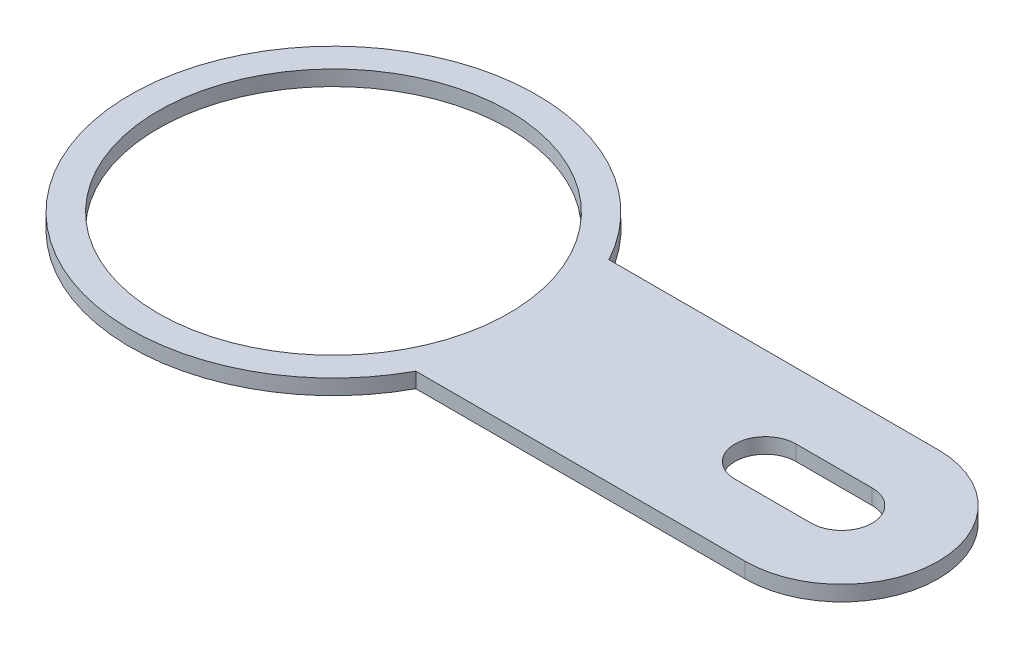
ISO-10303-21;
HEADER;
FILE_DESCRIPTION(('STEP AP214'),'2;1');
FILE_NAME('part.step','',(''),(''),'','','');
FILE_SCHEMA(('AUTOMOTIVE_DESIGN { 1 0 10303 214 1 1 1 1 }'));
ENDSEC;
DATA;
#1=APPLICATION_CONTEXT('core data for automotive mechanical design processes');
#2=APPLICATION_PROTOCOL_DEFINITION('international standard','automotive_design',2000,#1);
#3=PRODUCT_CONTEXT('',#1,'mechanical');
#4=PRODUCT('Part','Part','',(#3));
#5=PRODUCT_RELATED_PRODUCT_CATEGORY('part','',(#4));
#6=PRODUCT_DEFINITION_FORMATION('','',#4);
#7=PRODUCT_DEFINITION_CONTEXT('part definition',#1,'design');
#8=PRODUCT_DEFINITION('design','',#6,#7);
#9=PRODUCT_DEFINITION_SHAPE('','',#8);
#10=(LENGTH_UNIT() NAMED_UNIT(*) SI_UNIT(.MILLI.,.METRE.));
#11=(NAMED_UNIT(*) PLANE_ANGLE_UNIT() SI_UNIT($,.RADIAN.));
#12=(NAMED_UNIT(*) SI_UNIT($,.STERADIAN.) SOLID_ANGLE_UNIT());
#13=UNCERTAINTY_MEASURE_WITH_UNIT(LENGTH_MEASURE(1.E-05),#10,'distance_accuracy_value','');
#14=(GEOMETRIC_REPRESENTATION_CONTEXT(3) GLOBAL_UNCERTAINTY_ASSIGNED_CONTEXT((#13)) GLOBAL_UNIT_ASSIGNED_CONTEXT((#10,
#11,#12)) REPRESENTATION_CONTEXT('',''));
#15=CARTESIAN_POINT('',(0.,0.,0.));
#16=DIRECTION('',(0.,0.,1.));
#17=DIRECTION('',(1.,0.,0.));
#18=AXIS2_PLACEMENT_3D('',#15,#16,#17);
#19=CARTESIAN_POINT('',(10.,0.3,0.));
#20=DIRECTION('',(0.,-1.,0.));
#21=DIRECTION('',(0.,0.,-1.));
#22=AXIS2_PLACEMENT_3D('',#19,#20,#21);
#23=PLANE('',#22);
#24=CARTESIAN_POINT('',(0.,0.3,0.));
#25=DIRECTION('',(0.,1.,0.));
#26=DIRECTION('',(0.,0.,1.));
#27=AXIS2_PLACEMENT_3D('',#24,#25,#26);
#28=CIRCLE('',#27,3.45);
#29=CARTESIAN_POINT('',(0.,0.3,3.45));
#30=VERTEX_POINT('',#29);
#31=EDGE_CURVE('E136',#30,#30,#28,.T.);
#32=ORIENTED_EDGE('',*,*,#31,.F.);
#33=EDGE_LOOP('',(#32));
#34=FACE_BOUND('',#33,.T.);
#35=CARTESIAN_POINT('',(10.,0.3,0.));
#36=DIRECTION('',(0.,1.,0.));
#37=DIRECTION('',(0.,0.,-1.));
#38=AXIS2_PLACEMENT_3D('',#35,#36,#37);
#39=CIRCLE('',#38,1.9);
#40=CARTESIAN_POINT('',(10.,0.3,1.9));
#41=VERTEX_POINT('',#40);
#42=CARTESIAN_POINT('',(10.,0.3,-1.9));
#43=VERTEX_POINT('',#42);
#44=EDGE_CURVE('E142',#41,#43,#39,.T.);
#45=ORIENTED_EDGE('',*,*,#44,.T.);
#46=DIRECTION('',(-1.,0.,0.));
#47=VECTOR('',#46,1.);
#48=CARTESIAN_POINT('',(3.51994318135961,0.3,-1.9));
#49=LINE('',#48,#47);
#50=CARTESIAN_POINT('',(3.51994318135961,0.3,-1.9));
#51=VERTEX_POINT('',#50);
#52=EDGE_CURVE('E145',#43,#51,#49,.T.);
#53=ORIENTED_EDGE('',*,*,#52,.T.);
#54=CARTESIAN_POINT('',(0.,0.3,0.));
#55=DIRECTION('',(0.,1.,0.));
#56=DIRECTION('',(0.,0.,-1.));
#57=AXIS2_PLACEMENT_3D('',#54,#55,#56);
#58=CIRCLE('',#57,4.);
#59=CARTESIAN_POINT('',(3.51994318135961,0.3,1.9));
#60=VERTEX_POINT('',#59);
#61=EDGE_CURVE('E148',#51,#60,#58,.T.);
#62=ORIENTED_EDGE('',*,*,#61,.T.);
#63=DIRECTION('',(1.,0.,0.));
#64=VECTOR('',#63,1.);
#65=CARTESIAN_POINT('',(3.51994318135961,0.3,1.9));
#66=LINE('',#65,#64);
#67=EDGE_CURVE('E150',#60,#41,#66,.T.);
#68=ORIENTED_EDGE('',*,*,#67,.T.);
#69=EDGE_LOOP('',(#45,#53,#62,#68));
#70=FACE_BOUND('',#69,.T.);
#71=CARTESIAN_POINT('',(10.,0.3,0.));
#72=DIRECTION('',(0.,1.,0.));
#73=DIRECTION('',(0.,0.,1.));
#74=AXIS2_PLACEMENT_3D('',#71,#72,#73);
#75=CIRCLE('',#74,0.6);
#76=CARTESIAN_POINT('',(10.,0.3,0.600000000000012));
#77=VERTEX_POINT('',#76);
#78=CARTESIAN_POINT('',(10.,0.3,-0.599999999999988));
#79=VERTEX_POINT('',#78);
#80=EDGE_CURVE('E100',#77,#79,#75,.T.);
#81=ORIENTED_EDGE('',*,*,#80,.F.);
#82=DIRECTION('',(1.,0.,0.));
#83=VECTOR('',#82,1.);
#84=CARTESIAN_POINT('',(10.,0.3,0.600000000000012));
#85=LINE('',#84,#83);
#86=CARTESIAN_POINT('',(8.5,0.3,0.600000000000012));
#87=VERTEX_POINT('',#86);
#88=EDGE_CURVE('E122',#87,#77,#85,.T.);
#89=ORIENTED_EDGE('',*,*,#88,.F.);
#90=CARTESIAN_POINT('',(8.5,0.3,0.));
#91=DIRECTION('',(0.,1.,0.));
#92=DIRECTION('',(0.,0.,1.));
#93=AXIS2_PLACEMENT_3D('',#90,#91,#92);
#94=CIRCLE('',#93,0.6);
#95=CARTESIAN_POINT('',(8.5,0.3,-0.599999999999988));
#96=VERTEX_POINT('',#95);
#97=EDGE_CURVE('E120',#96,#87,#94,.T.);
#98=ORIENTED_EDGE('',*,*,#97,.F.);
#99=DIRECTION('',(-1.,0.,0.));
#100=VECTOR('',#99,1.);
#101=CARTESIAN_POINT('',(10.,0.3,-0.599999999999988));
#102=LINE('',#101,#100);
#103=EDGE_CURVE('E108',#79,#96,#102,.T.);
#104=ORIENTED_EDGE('',*,*,#103,.F.);
#105=EDGE_LOOP('',(#81,#89,#98,#104));
#106=FACE_BOUND('',#105,.T.);
#107=ADVANCED_FACE('F35',(#34,#70,#106),#23,.F.);
#108=CARTESIAN_POINT('',(10.,0.,0.));
#109=DIRECTION('',(0.,-1.,0.));
#110=DIRECTION('',(0.,0.,-1.));
#111=AXIS2_PLACEMENT_3D('',#108,#109,#110);
#112=PLANE('',#111);
#113=CARTESIAN_POINT('',(0.,0.,0.));
#114=DIRECTION('',(0.,1.,0.));
#115=DIRECTION('',(0.,0.,1.));
#116=AXIS2_PLACEMENT_3D('',#113,#114,#115);
#117=CIRCLE('',#116,3.45);
#118=CARTESIAN_POINT('',(0.,0.,3.45));
#119=VERTEX_POINT('',#118);
#120=EDGE_CURVE('E116',#119,#119,#117,.T.);
#121=ORIENTED_EDGE('',*,*,#120,.T.);
#122=EDGE_LOOP('',(#121));
#123=FACE_BOUND('',#122,.T.);
#124=CARTESIAN_POINT('',(10.,0.,0.));
#125=DIRECTION('',(0.,1.,0.));
#126=DIRECTION('',(0.,0.,-1.));
#127=AXIS2_PLACEMENT_3D('',#124,#125,#126);
#128=CIRCLE('',#127,1.9);
#129=CARTESIAN_POINT('',(10.,0.,1.9));
#130=VERTEX_POINT('',#129);
#131=CARTESIAN_POINT('',(10.,0.,-1.9));
#132=VERTEX_POINT('',#131);
#133=EDGE_CURVE('E139',#130,#132,#128,.T.);
#134=ORIENTED_EDGE('',*,*,#133,.F.);
#135=DIRECTION('',(1.,0.,0.));
#136=VECTOR('',#135,1.);
#137=CARTESIAN_POINT('',(3.51994318135961,0.,1.9));
#138=LINE('',#137,#136);
#139=CARTESIAN_POINT('',(3.51994318135961,0.,1.9));
#140=VERTEX_POINT('',#139);
#141=EDGE_CURVE('E146',#140,#130,#138,.T.);
#142=ORIENTED_EDGE('',*,*,#141,.F.);
#143=CARTESIAN_POINT('',(0.,0.,0.));
#144=DIRECTION('',(0.,1.,0.));
#145=DIRECTION('',(0.,0.,-1.));
#146=AXIS2_PLACEMENT_3D('',#143,#144,#145);
#147=CIRCLE('',#146,4.);
#148=CARTESIAN_POINT('',(3.51994318135961,0.,-1.9));
#149=VERTEX_POINT('',#148);
#150=EDGE_CURVE('E157',#149,#140,#147,.T.);
#151=ORIENTED_EDGE('',*,*,#150,.F.);
#152=DIRECTION('',(-1.,0.,0.));
#153=VECTOR('',#152,1.);
#154=CARTESIAN_POINT('',(3.51994318135961,0.,-1.9));
#155=LINE('',#154,#153);
#156=EDGE_CURVE('E155',#132,#149,#155,.T.);
#157=ORIENTED_EDGE('',*,*,#156,.F.);
#158=EDGE_LOOP('',(#134,#142,#151,#157));
#159=FACE_BOUND('',#158,.T.);
#160=DIRECTION('',(1.,0.,0.));
#161=VECTOR('',#160,1.);
#162=CARTESIAN_POINT('',(10.,0.,0.600000000000012));
#163=LINE('',#162,#161);
#164=CARTESIAN_POINT('',(8.5,0.,0.600000000000012));
#165=VERTEX_POINT('',#164);
#166=CARTESIAN_POINT('',(10.,0.,0.600000000000012));
#167=VERTEX_POINT('',#166);
#168=EDGE_CURVE('E109',#165,#167,#163,.T.);
#169=ORIENTED_EDGE('',*,*,#168,.T.);
#170=CARTESIAN_POINT('',(10.,0.,0.));
#171=DIRECTION('',(0.,1.,0.));
#172=DIRECTION('',(0.,0.,1.));
#173=AXIS2_PLACEMENT_3D('',#170,#171,#172);
#174=CIRCLE('',#173,0.6);
#175=CARTESIAN_POINT('',(10.,0.,-0.599999999999988));
#176=VERTEX_POINT('',#175);
#177=EDGE_CURVE('E58',#167,#176,#174,.T.);
#178=ORIENTED_EDGE('',*,*,#177,.T.);
#179=DIRECTION('',(-1.,0.,0.));
#180=VECTOR('',#179,1.);
#181=CARTESIAN_POINT('',(10.,0.,-0.599999999999988));
#182=LINE('',#181,#180);
#183=CARTESIAN_POINT('',(8.5,0.,-0.599999999999988));
#184=VERTEX_POINT('',#183);
#185=EDGE_CURVE('E115',#176,#184,#182,.T.);
#186=ORIENTED_EDGE('',*,*,#185,.T.);
#187=CARTESIAN_POINT('',(8.5,0.,0.));
#188=DIRECTION('',(0.,1.,0.));
#189=DIRECTION('',(0.,0.,1.));
#190=AXIS2_PLACEMENT_3D('',#187,#188,#189);
#191=CIRCLE('',#190,0.6);
#192=EDGE_CURVE('E128',#184,#165,#191,.T.);
#193=ORIENTED_EDGE('',*,*,#192,.T.);
#194=EDGE_LOOP('',(#169,#178,#186,#193));
#195=FACE_BOUND('',#194,.T.);
#196=ADVANCED_FACE('F175',(#123,#159,#195),#112,.T.);
#197=CARTESIAN_POINT('',(10.,0.3,0.));
#198=DIRECTION('',(0.,-1.,0.));
#199=DIRECTION('',(0.,0.,-1.));
#200=AXIS2_PLACEMENT_3D('',#197,#198,#199);
#201=CYLINDRICAL_SURFACE('',#200,1.9);
#202=ORIENTED_EDGE('',*,*,#133,.T.);
#203=DIRECTION('',(0.,-1.,0.));
#204=VECTOR('',#203,1.);
#205=CARTESIAN_POINT('',(10.,0.3,-1.9));
#206=LINE('',#205,#204);
#207=EDGE_CURVE('E11',#43,#132,#206,.T.);
#208=ORIENTED_EDGE('',*,*,#207,.F.);
#209=ORIENTED_EDGE('',*,*,#44,.F.);
#210=DIRECTION('',(0.,-1.,0.));
#211=VECTOR('',#210,1.);
#212=CARTESIAN_POINT('',(10.,0.3,1.9));
#213=LINE('',#212,#211);
#214=EDGE_CURVE('E152',#41,#130,#213,.T.);
#215=ORIENTED_EDGE('',*,*,#214,.T.);
#216=EDGE_LOOP('',(#202,#208,#209,#215));
#217=FACE_BOUND('',#216,.T.);
#218=ADVANCED_FACE('F37',(#217),#201,.T.);
#219=CARTESIAN_POINT('',(3.51994318135961,0.3,-1.9));
#220=DIRECTION('',(0.,0.,1.));
#221=DIRECTION('',(1.,0.,0.));
#222=AXIS2_PLACEMENT_3D('',#219,#220,#221);
#223=PLANE('',#222);
#224=ORIENTED_EDGE('',*,*,#156,.T.);
#225=DIRECTION('',(0.,-1.,0.));
#226=VECTOR('',#225,1.);
#227=CARTESIAN_POINT('',(3.51994318135961,0.3,-1.9));
#228=LINE('',#227,#226);
#229=EDGE_CURVE('E43',#51,#149,#228,.T.);
#230=ORIENTED_EDGE('',*,*,#229,.F.);
#231=ORIENTED_EDGE('',*,*,#52,.F.);
#232=ORIENTED_EDGE('',*,*,#207,.T.);
#233=EDGE_LOOP('',(#224,#230,#231,#232));
#234=FACE_BOUND('',#233,.T.);
#235=ADVANCED_FACE('F185',(#234),#223,.F.);
#236=CARTESIAN_POINT('',(0.,0.3,0.));
#237=DIRECTION('',(0.,-1.,0.));
#238=DIRECTION('',(0.,0.,-1.));
#239=AXIS2_PLACEMENT_3D('',#236,#237,#238);
#240=CYLINDRICAL_SURFACE('',#239,4.);
#241=ORIENTED_EDGE('',*,*,#150,.T.);
#242=DIRECTION('',(0.,-1.,0.));
#243=VECTOR('',#242,1.);
#244=CARTESIAN_POINT('',(3.51994318135961,0.3,1.9));
#245=LINE('',#244,#243);
#246=EDGE_CURVE('E162',#60,#140,#245,.T.);
#247=ORIENTED_EDGE('',*,*,#246,.F.);
#248=ORIENTED_EDGE('',*,*,#61,.F.);
#249=ORIENTED_EDGE('',*,*,#229,.T.);
#250=EDGE_LOOP('',(#241,#247,#248,#249));
#251=FACE_BOUND('',#250,.T.);
#252=ADVANCED_FACE('F169',(#251),#240,.T.);
#253=CARTESIAN_POINT('',(3.51994318135961,0.3,1.9));
#254=DIRECTION('',(0.,0.,-1.));
#255=DIRECTION('',(-1.,0.,0.));
#256=AXIS2_PLACEMENT_3D('',#253,#254,#255);
#257=PLANE('',#256);
#258=ORIENTED_EDGE('',*,*,#141,.T.);
#259=ORIENTED_EDGE('',*,*,#214,.F.);
#260=ORIENTED_EDGE('',*,*,#67,.F.);
#261=ORIENTED_EDGE('',*,*,#246,.T.);
#262=EDGE_LOOP('',(#258,#259,#260,#261));
#263=FACE_BOUND('',#262,.T.);
#264=ADVANCED_FACE('F179',(#263),#257,.F.);
#265=CARTESIAN_POINT('',(0.,0.3,0.));
#266=DIRECTION('',(0.,-1.,0.));
#267=DIRECTION('',(0.,0.,-1.));
#268=AXIS2_PLACEMENT_3D('',#265,#266,#267);
#269=CYLINDRICAL_SURFACE('',#268,3.45);
#270=ORIENTED_EDGE('',*,*,#31,.T.);
#271=EDGE_LOOP('',(#270));
#272=FACE_BOUND('',#271,.T.);
#273=ORIENTED_EDGE('',*,*,#120,.F.);
#274=EDGE_LOOP('',(#273));
#275=FACE_BOUND('',#274,.T.);
#276=ADVANCED_FACE('F202',(#272,#275),#269,.F.);
#277=CARTESIAN_POINT('',(10.,0.3,0.));
#278=DIRECTION('',(0.,-1.,0.));
#279=DIRECTION('',(0.,0.,-1.));
#280=AXIS2_PLACEMENT_3D('',#277,#278,#279);
#281=CYLINDRICAL_SURFACE('',#280,0.6);
#282=ORIENTED_EDGE('',*,*,#177,.F.);
#283=DIRECTION('',(0.,-1.,0.));
#284=VECTOR('',#283,1.);
#285=CARTESIAN_POINT('',(10.,0.3,0.600000000000012));
#286=LINE('',#285,#284);
#287=EDGE_CURVE('E104',#77,#167,#286,.T.);
#288=ORIENTED_EDGE('',*,*,#287,.F.);
#289=ORIENTED_EDGE('',*,*,#80,.T.);
#290=DIRECTION('',(0.,-1.,0.));
#291=VECTOR('',#290,1.);
#292=CARTESIAN_POINT('',(10.,0.3,-0.599999999999988));
#293=LINE('',#292,#291);
#294=EDGE_CURVE('E103',#79,#176,#293,.T.);
#295=ORIENTED_EDGE('',*,*,#294,.T.);
#296=EDGE_LOOP('',(#282,#288,#289,#295));
#297=FACE_BOUND('',#296,.T.);
#298=ADVANCED_FACE('F102',(#297),#281,.F.);
#299=CARTESIAN_POINT('',(10.,0.3,-0.599999999999988));
#300=DIRECTION('',(0.,0.,1.));
#301=DIRECTION('',(1.,0.,0.));
#302=AXIS2_PLACEMENT_3D('',#299,#300,#301);
#303=PLANE('',#302);
#304=ORIENTED_EDGE('',*,*,#185,.F.);
#305=ORIENTED_EDGE('',*,*,#294,.F.);
#306=ORIENTED_EDGE('',*,*,#103,.T.);
#307=DIRECTION('',(0.,-1.,0.));
#308=VECTOR('',#307,1.);
#309=CARTESIAN_POINT('',(8.5,0.3,-0.599999999999988));
#310=LINE('',#309,#308);
#311=EDGE_CURVE('E117',#96,#184,#310,.T.);
#312=ORIENTED_EDGE('',*,*,#311,.T.);
#313=EDGE_LOOP('',(#304,#305,#306,#312));
#314=FACE_BOUND('',#313,.T.);
#315=ADVANCED_FACE('F112',(#314),#303,.T.);
#316=CARTESIAN_POINT('',(8.5,0.3,0.));
#317=DIRECTION('',(0.,-1.,0.));
#318=DIRECTION('',(0.,0.,-1.));
#319=AXIS2_PLACEMENT_3D('',#316,#317,#318);
#320=CYLINDRICAL_SURFACE('',#319,0.6);
#321=ORIENTED_EDGE('',*,*,#192,.F.);
#322=ORIENTED_EDGE('',*,*,#311,.F.);
#323=ORIENTED_EDGE('',*,*,#97,.T.);
#324=DIRECTION('',(0.,-1.,0.));
#325=VECTOR('',#324,1.);
#326=CARTESIAN_POINT('',(8.5,0.3,0.600000000000012));
#327=LINE('',#326,#325);
#328=EDGE_CURVE('E50',#87,#165,#327,.T.);
#329=ORIENTED_EDGE('',*,*,#328,.T.);
#330=EDGE_LOOP('',(#321,#322,#323,#329));
#331=FACE_BOUND('',#330,.T.);
#332=ADVANCED_FACE('F218',(#331),#320,.F.);
#333=CARTESIAN_POINT('',(10.,0.3,0.600000000000012));
#334=DIRECTION('',(0.,0.,-1.));
#335=DIRECTION('',(-1.,0.,0.));
#336=AXIS2_PLACEMENT_3D('',#333,#334,#335);
#337=PLANE('',#336);
#338=ORIENTED_EDGE('',*,*,#168,.F.);
#339=ORIENTED_EDGE('',*,*,#328,.F.);
#340=ORIENTED_EDGE('',*,*,#88,.T.);
#341=ORIENTED_EDGE('',*,*,#287,.T.);
#342=EDGE_LOOP('',(#338,#339,#340,#341));
#343=FACE_BOUND('',#342,.T.);
#344=ADVANCED_FACE('F223',(#343),#337,.T.);
#345=CLOSED_SHELL('',(#107,#196,#218,#235,#252,#264,#276,#298,#315,#332,#344));
#346=MANIFOLD_SOLID_BREP('B2',#345);
#347=ADVANCED_BREP_SHAPE_REPRESENTATION('',(#18,#346),#14);
#348=SHAPE_DEFINITION_REPRESENTATION(#9,#347);
ENDSEC;
END-ISO-10303-21;
